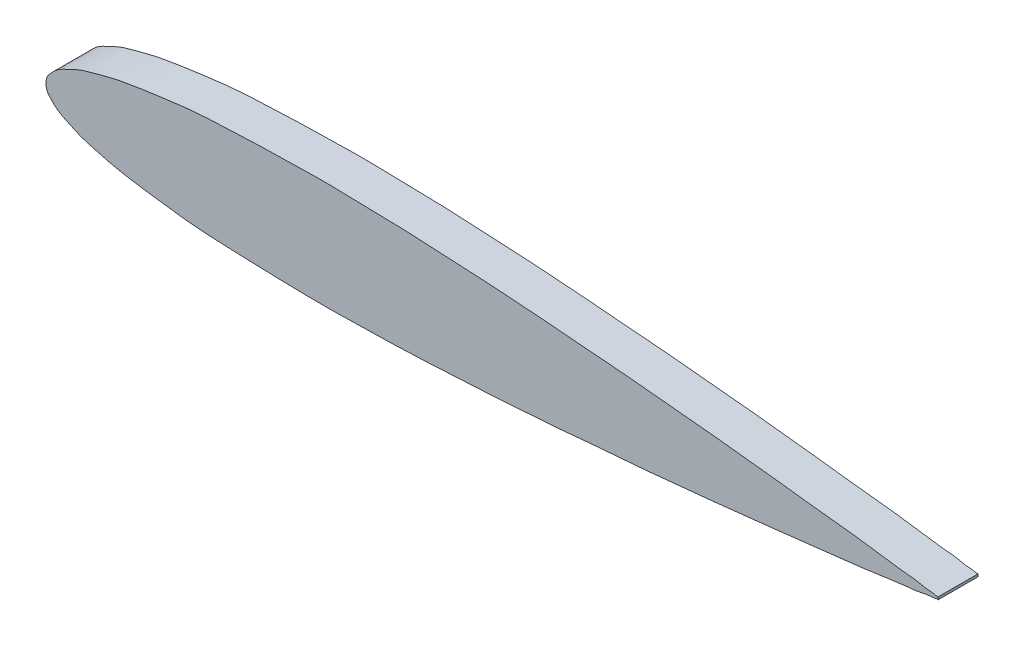
ISO-10303-21;
HEADER;
FILE_DESCRIPTION(('STEP AP214'),'2;1');
FILE_NAME('part.step','',(''),(''),'','','');
FILE_SCHEMA(('AUTOMOTIVE_DESIGN { 1 0 10303 214 1 1 1 1 }'));
ENDSEC;
DATA;
#1=APPLICATION_CONTEXT('core data for automotive mechanical design processes');
#2=APPLICATION_PROTOCOL_DEFINITION('international standard','automotive_design',2000,#1);
#3=PRODUCT_CONTEXT('',#1,'mechanical');
#4=PRODUCT('Part','Part','',(#3));
#5=PRODUCT_RELATED_PRODUCT_CATEGORY('part','',(#4));
#6=PRODUCT_DEFINITION_FORMATION('','',#4);
#7=PRODUCT_DEFINITION_CONTEXT('part definition',#1,'design');
#8=PRODUCT_DEFINITION('design','',#6,#7);
#9=PRODUCT_DEFINITION_SHAPE('','',#8);
#10=(LENGTH_UNIT() NAMED_UNIT(*) SI_UNIT(.MILLI.,.METRE.));
#11=(NAMED_UNIT(*) PLANE_ANGLE_UNIT() SI_UNIT($,.RADIAN.));
#12=(NAMED_UNIT(*) SI_UNIT($,.STERADIAN.) SOLID_ANGLE_UNIT());
#13=UNCERTAINTY_MEASURE_WITH_UNIT(LENGTH_MEASURE(1.E-05),#10,'distance_accuracy_value','');
#14=(GEOMETRIC_REPRESENTATION_CONTEXT(3) GLOBAL_UNCERTAINTY_ASSIGNED_CONTEXT((#13)) GLOBAL_UNIT_ASSIGNED_CONTEXT((#10,
#11,#12)) REPRESENTATION_CONTEXT('',''));
#15=CARTESIAN_POINT('',(0.,0.,0.));
#16=DIRECTION('',(0.,0.,1.));
#17=DIRECTION('',(1.,0.,0.));
#18=AXIS2_PLACEMENT_3D('',#15,#16,#17);
#19=CARTESIAN_POINT('',(0.,0.,-15.96));
#20=DIRECTION('',(0.,0.,1.));
#21=DIRECTION('',(1.,0.,0.));
#22=AXIS2_PLACEMENT_3D('',#19,#20,#21);
#23=PLANE('',#22);
#24=DIRECTION('',(0.,1.,0.));
#25=VECTOR('',#24,1.);
#26=CARTESIAN_POINT('',(357.89,0.51,-15.96));
#27=LINE('',#26,#25);
#28=CARTESIAN_POINT('',(357.89,-0.51,-15.96));
#29=VERTEX_POINT('',#28);
#30=CARTESIAN_POINT('',(357.89,0.51,-15.96));
#31=VERTEX_POINT('',#30);
#32=EDGE_CURVE('E78',#29,#31,#27,.T.);
#33=ORIENTED_EDGE('',*,*,#32,.F.);
#34=CARTESIAN_POINT('',(357.89,0.51,-15.96));
#35=CARTESIAN_POINT('',(357.719646917638,0.505921572841798,-15.96));
#36=CARTESIAN_POINT('',(357.031457109049,0.489445604421162,-15.96));
#37=CARTESIAN_POINT('',(355.448095415412,0.921810978975273,-15.96));
#38=CARTESIAN_POINT('',(352.680293301441,0.90095439623579,-15.96));
#39=CARTESIAN_POINT('',(348.957066021364,2.01520125980667,-15.96));
#40=CARTESIAN_POINT('',(344.0645014606,2.22917896767638,-15.96));
#41=CARTESIAN_POINT('',(338.235146468501,3.09922065903866,-15.96));
#42=CARTESIAN_POINT('',(331.393672923208,4.13758684020932,-15.96));
#43=CARTESIAN_POINT('',(323.597761630089,5.11628057463696,-15.96));
#44=CARTESIAN_POINT('',(314.882443830129,6.17828912685919,-15.96));
#45=CARTESIAN_POINT('',(305.293130734855,7.07725232689124,-15.96));
#46=CARTESIAN_POINT('',(294.985863675319,8.42983706148255,-15.96));
#47=CARTESIAN_POINT('',(283.977867006548,9.69066102593276,-15.96));
#48=CARTESIAN_POINT('',(272.375704707007,10.941886728925,-15.96));
#49=CARTESIAN_POINT('',(260.101492172459,12.2387824025472,-15.96));
#50=CARTESIAN_POINT('',(247.312075014399,13.4440845936858,-15.96));
#51=CARTESIAN_POINT('',(234.122924460674,14.8365121456862,-15.96));
#52=CARTESIAN_POINT('',(220.62780271951,15.648425333477,-15.96));
#53=CARTESIAN_POINT('',(206.943423861164,17.1374754411791,-15.96));
#54=CARTESIAN_POINT('',(193.035803629134,17.9766016297824,-15.96));
#55=CARTESIAN_POINT('',(178.998423130644,19.1472716709331,-15.96));
#56=CARTESIAN_POINT('',(164.930628496034,19.7652584635785,-15.96));
#57=CARTESIAN_POINT('',(150.970022584434,20.6192056737092,-15.96));
#58=CARTESIAN_POINT('',(137.249966534669,21.1393456722067,-15.96));
#59=CARTESIAN_POINT('',(123.783214426583,21.2841033943283,-15.96));
#60=CARTESIAN_POINT('',(110.659687231223,21.7439406265103,-15.96));
#61=CARTESIAN_POINT('',(97.8741361414242,21.2812625614655,-15.96));
#62=CARTESIAN_POINT('',(85.6735500131455,21.1922492666694,-15.96));
#63=CARTESIAN_POINT('',(73.9996496969005,20.5135685894506,-15.96));
#64=CARTESIAN_POINT('',(62.9682496415754,20.2247733516122,-15.96));
#65=CARTESIAN_POINT('',(52.6401030806784,19.1522879815025,-15.96));
#66=CARTESIAN_POINT('',(43.1755939216454,17.8091818067298,-15.96));
#67=CARTESIAN_POINT('',(34.518431340811,16.6108019228167,-15.96));
#68=CARTESIAN_POINT('',(26.6936934738994,15.1655174934838,-15.96));
#69=CARTESIAN_POINT('',(19.8862932147171,13.2851537730244,-15.96));
#70=CARTESIAN_POINT('',(13.8083523401894,11.6800943694312,-15.96));
#71=CARTESIAN_POINT('',(9.04993148298527,9.28720173126534,-15.96));
#72=CARTESIAN_POINT('',(4.93777046882712,7.46902396666879,-15.96));
#73=CARTESIAN_POINT('',(2.40834869494993,4.9776750118051,-15.96));
#74=CARTESIAN_POINT('',(0.307350295607263,2.75818606627847,-15.96));
#75=CARTESIAN_POINT('',(-0.145006844762799,0.,-15.96));
#76=CARTESIAN_POINT('',(0.307350295607263,-2.75818606627847,-15.96));
#77=CARTESIAN_POINT('',(2.40834869494993,-4.97767501180511,-15.96));
#78=CARTESIAN_POINT('',(4.9377704688271,-7.46902396666878,-15.96));
#79=CARTESIAN_POINT('',(9.0499314829853,-9.28720173126536,-15.96));
#80=CARTESIAN_POINT('',(13.8083523401894,-11.6800943694312,-15.96));
#81=CARTESIAN_POINT('',(19.8862932147171,-13.2851537730243,-15.96));
#82=CARTESIAN_POINT('',(26.6936934738993,-15.1655174934838,-15.96));
#83=CARTESIAN_POINT('',(34.5184313408111,-16.6108019228167,-15.96));
#84=CARTESIAN_POINT('',(43.1755939216453,-17.8091818067298,-15.96));
#85=CARTESIAN_POINT('',(52.6401030806785,-19.1522879815025,-15.96));
#86=CARTESIAN_POINT('',(62.9682496415753,-20.2247733516122,-15.96));
#87=CARTESIAN_POINT('',(73.9996496969005,-20.5135685894506,-15.96));
#88=CARTESIAN_POINT('',(85.6735500131454,-21.1922492666694,-15.96));
#89=CARTESIAN_POINT('',(97.8741361414243,-21.2812625614655,-15.96));
#90=CARTESIAN_POINT('',(110.659687231223,-21.7439406265103,-15.96));
#91=CARTESIAN_POINT('',(123.783214426583,-21.2841033943283,-15.96));
#92=CARTESIAN_POINT('',(137.249966534669,-21.1393456722067,-15.96));
#93=CARTESIAN_POINT('',(150.970022584434,-20.6192056737092,-15.96));
#94=CARTESIAN_POINT('',(164.930628496034,-19.7652584635785,-15.96));
#95=CARTESIAN_POINT('',(178.998423130644,-19.1472716709331,-15.96));
#96=CARTESIAN_POINT('',(193.035803629134,-17.9766016297824,-15.96));
#97=CARTESIAN_POINT('',(206.943423861164,-17.1374754411791,-15.96));
#98=CARTESIAN_POINT('',(220.62780271951,-15.648425333477,-15.96));
#99=CARTESIAN_POINT('',(234.122924460674,-14.8365121456862,-15.96));
#100=CARTESIAN_POINT('',(247.312075014399,-13.4440845936858,-15.96));
#101=CARTESIAN_POINT('',(260.101492172459,-12.2387824025472,-15.96));
#102=CARTESIAN_POINT('',(272.375704707007,-10.941886728925,-15.96));
#103=CARTESIAN_POINT('',(283.977867006547,-9.69066102593277,-15.96));
#104=CARTESIAN_POINT('',(294.985863675319,-8.42983706148255,-15.96));
#105=CARTESIAN_POINT('',(305.293130734855,-7.07725232689124,-15.96));
#106=CARTESIAN_POINT('',(314.882443830129,-6.17828912685919,-15.96));
#107=CARTESIAN_POINT('',(323.597761630088,-5.11628057463696,-15.96));
#108=CARTESIAN_POINT('',(331.393672923209,-4.13758684020931,-15.96));
#109=CARTESIAN_POINT('',(338.235146468501,-3.09922065903867,-15.96));
#110=CARTESIAN_POINT('',(344.0645014606,-2.22917896767638,-15.96));
#111=CARTESIAN_POINT('',(348.957066021365,-2.01520125980667,-15.96));
#112=CARTESIAN_POINT('',(352.680293301441,-0.900954396235786,-15.96));
#113=CARTESIAN_POINT('',(355.448095415412,-0.921810978975272,-15.96));
#114=CARTESIAN_POINT('',(357.031457109049,-0.489445604421162,-15.96));
#115=CARTESIAN_POINT('',(357.719646917638,-0.505921572841798,-15.96));
#116=CARTESIAN_POINT('',(357.89,-0.51,-15.96));
#117=B_SPLINE_CURVE_WITH_KNOTS('',3,(#34,#35,#36,#37,#38,#39,#40,#41,#42,#43,#44,#45,#46,#47,
#48,#49,#50,#51,#52,#53,#54,#55,#56,#57,#58,#59,#60,#61,#62,#63,#64,#65,#66,#67,#68,#69,#70,#71,
#72,#73,#74,#75,#76,#77,#78,#79,#80,#81,#82,#83,#84,#85,#86,#87,#88,#89,#90,#91,#92,#93,#94,#95,
#96,#97,#98,#99,#100,#101,#102,#103,#104,#105,#106,#107,#108,#109,#110,#111,#112,#113,#114,#115,
#116),.UNSPECIFIED.,.F.,.F.,(4,1,1,1,1,1,1,1,1,1,1,1,1,1,1,1,1,1,1,1,1,1,1,1,1,1,1,1,1,1,1,1,1,
1,1,1,1,1,1,1,1,1,1,1,1,1,1,1,1,1,1,1,1,1,1,1,1,1,1,1,1,1,1,1,1,1,1,1,1,1,1,1,1,1,1,1,1,1,1,1,
4),(0.,0.000698767546102638,0.00282287057641789,0.00666210294870497,0.0119851512501213,
0.0186396801468936,0.0267087250122721,0.0362091585625878,0.0470822882687063,0.0590024405257511,
0.0722964396022678,0.0866652687945305,0.101727960502694,0.1178390518878,0.134631365152862,
0.15245969992926,0.170642601576784,0.189137461126776,0.208016041696824,0.227206750787311,
0.246398452739791,0.265909542840843,0.285078596718305,0.303889796655365,0.322335219621859,
0.340437910137479,0.357841963230223,0.374903831461308,0.390580026839433,0.405899731285183,
0.420244749695898,0.433227432414806,0.445192580255448,0.456174796493744,0.465885160109924,
0.474250152506373,0.481884938165317,0.48779988101342,0.492476430267749,0.496450404883876,0.5,
0.503549595116124,0.507523569732251,0.51220011898658,0.518115061834683,0.525749847493627,
0.534114839890076,0.543825203506256,0.554807419744552,0.566772567585194,0.579755250304102,
0.594100268714817,0.609419973160567,0.625096168538692,0.642158036769777,0.659562089862521,
0.677664780378141,0.696110203344635,0.714921403281695,0.734090457159157,0.753601547260209,
0.772793249212689,0.791983958303176,0.810862538873224,0.829357398423216,0.847540300070741,
0.865368634847139,0.8821609481122,0.898272039497306,0.91333473120547,0.927703560397732,
0.940997559474249,0.952917711731294,0.963790841437412,0.973291274987728,0.981360319853106,
0.988014848749879,0.993337897051295,0.997177129423582,0.999301232453897,1.),.UNSPECIFIED.);
#118=EDGE_CURVE('E83',#31,#29,#117,.T.);
#119=ORIENTED_EDGE('',*,*,#118,.F.);
#120=EDGE_LOOP('',(#33,#119));
#121=FACE_BOUND('',#120,.T.);
#122=ADVANCED_FACE('F45',(#121),#23,.F.);
#123=DIRECTION('',(0.,0.,1.));
#124=VECTOR('',#123,1.);
#125=SURFACE_OF_LINEAR_EXTRUSION('',#117,#124);
#126=CARTESIAN_POINT('',(357.89,0.51,0.));
#127=CARTESIAN_POINT('',(357.719646917638,0.505921572841798,0.));
#128=CARTESIAN_POINT('',(357.031457109049,0.489445604421162,0.));
#129=CARTESIAN_POINT('',(355.448095415412,0.921810978975273,0.));
#130=CARTESIAN_POINT('',(352.680293301441,0.90095439623579,0.));
#131=CARTESIAN_POINT('',(348.957066021364,2.01520125980667,0.));
#132=CARTESIAN_POINT('',(344.0645014606,2.22917896767638,0.));
#133=CARTESIAN_POINT('',(338.235146468501,3.09922065903866,0.));
#134=CARTESIAN_POINT('',(331.393672923208,4.13758684020932,0.));
#135=CARTESIAN_POINT('',(323.597761630089,5.11628057463696,0.));
#136=CARTESIAN_POINT('',(314.882443830129,6.17828912685919,0.));
#137=CARTESIAN_POINT('',(305.293130734855,7.07725232689124,0.));
#138=CARTESIAN_POINT('',(294.985863675319,8.42983706148255,0.));
#139=CARTESIAN_POINT('',(283.977867006548,9.69066102593276,0.));
#140=CARTESIAN_POINT('',(272.375704707007,10.941886728925,0.));
#141=CARTESIAN_POINT('',(260.101492172459,12.2387824025472,0.));
#142=CARTESIAN_POINT('',(247.312075014399,13.4440845936858,0.));
#143=CARTESIAN_POINT('',(234.122924460674,14.8365121456862,0.));
#144=CARTESIAN_POINT('',(220.62780271951,15.648425333477,0.));
#145=CARTESIAN_POINT('',(206.943423861164,17.1374754411791,0.));
#146=CARTESIAN_POINT('',(193.035803629134,17.9766016297824,0.));
#147=CARTESIAN_POINT('',(178.998423130644,19.1472716709331,0.));
#148=CARTESIAN_POINT('',(164.930628496034,19.7652584635785,0.));
#149=CARTESIAN_POINT('',(150.970022584434,20.6192056737092,0.));
#150=CARTESIAN_POINT('',(137.249966534669,21.1393456722067,0.));
#151=CARTESIAN_POINT('',(123.783214426583,21.2841033943283,0.));
#152=CARTESIAN_POINT('',(110.659687231223,21.7439406265103,0.));
#153=CARTESIAN_POINT('',(97.8741361414242,21.2812625614655,0.));
#154=CARTESIAN_POINT('',(85.6735500131455,21.1922492666694,0.));
#155=CARTESIAN_POINT('',(73.9996496969005,20.5135685894506,0.));
#156=CARTESIAN_POINT('',(62.9682496415754,20.2247733516122,0.));
#157=CARTESIAN_POINT('',(52.6401030806784,19.1522879815025,0.));
#158=CARTESIAN_POINT('',(43.1755939216454,17.8091818067298,0.));
#159=CARTESIAN_POINT('',(34.518431340811,16.6108019228167,0.));
#160=CARTESIAN_POINT('',(26.6936934738994,15.1655174934838,0.));
#161=CARTESIAN_POINT('',(19.8862932147171,13.2851537730244,0.));
#162=CARTESIAN_POINT('',(13.8083523401894,11.6800943694312,0.));
#163=CARTESIAN_POINT('',(9.04993148298527,9.28720173126534,0.));
#164=CARTESIAN_POINT('',(4.93777046882712,7.46902396666879,0.));
#165=CARTESIAN_POINT('',(2.40834869494993,4.9776750118051,0.));
#166=CARTESIAN_POINT('',(0.307350295607263,2.75818606627847,0.));
#167=CARTESIAN_POINT('',(-0.145006844762799,0.,0.));
#168=CARTESIAN_POINT('',(0.307350295607263,-2.75818606627847,0.));
#169=CARTESIAN_POINT('',(2.40834869494993,-4.97767501180511,0.));
#170=CARTESIAN_POINT('',(4.9377704688271,-7.46902396666878,0.));
#171=CARTESIAN_POINT('',(9.0499314829853,-9.28720173126536,0.));
#172=CARTESIAN_POINT('',(13.8083523401894,-11.6800943694312,0.));
#173=CARTESIAN_POINT('',(19.8862932147171,-13.2851537730243,0.));
#174=CARTESIAN_POINT('',(26.6936934738993,-15.1655174934838,0.));
#175=CARTESIAN_POINT('',(34.5184313408111,-16.6108019228167,0.));
#176=CARTESIAN_POINT('',(43.1755939216453,-17.8091818067298,0.));
#177=CARTESIAN_POINT('',(52.6401030806785,-19.1522879815025,0.));
#178=CARTESIAN_POINT('',(62.9682496415753,-20.2247733516122,0.));
#179=CARTESIAN_POINT('',(73.9996496969005,-20.5135685894506,0.));
#180=CARTESIAN_POINT('',(85.6735500131454,-21.1922492666694,0.));
#181=CARTESIAN_POINT('',(97.8741361414243,-21.2812625614655,0.));
#182=CARTESIAN_POINT('',(110.659687231223,-21.7439406265103,0.));
#183=CARTESIAN_POINT('',(123.783214426583,-21.2841033943283,0.));
#184=CARTESIAN_POINT('',(137.249966534669,-21.1393456722067,0.));
#185=CARTESIAN_POINT('',(150.970022584434,-20.6192056737092,0.));
#186=CARTESIAN_POINT('',(164.930628496034,-19.7652584635785,0.));
#187=CARTESIAN_POINT('',(178.998423130644,-19.1472716709331,0.));
#188=CARTESIAN_POINT('',(193.035803629134,-17.9766016297824,0.));
#189=CARTESIAN_POINT('',(206.943423861164,-17.1374754411791,0.));
#190=CARTESIAN_POINT('',(220.62780271951,-15.648425333477,0.));
#191=CARTESIAN_POINT('',(234.122924460674,-14.8365121456862,0.));
#192=CARTESIAN_POINT('',(247.312075014399,-13.4440845936858,0.));
#193=CARTESIAN_POINT('',(260.101492172459,-12.2387824025472,0.));
#194=CARTESIAN_POINT('',(272.375704707007,-10.941886728925,0.));
#195=CARTESIAN_POINT('',(283.977867006547,-9.69066102593277,0.));
#196=CARTESIAN_POINT('',(294.985863675319,-8.42983706148255,0.));
#197=CARTESIAN_POINT('',(305.293130734855,-7.07725232689124,0.));
#198=CARTESIAN_POINT('',(314.882443830129,-6.17828912685919,0.));
#199=CARTESIAN_POINT('',(323.597761630088,-5.11628057463696,0.));
#200=CARTESIAN_POINT('',(331.393672923209,-4.13758684020931,0.));
#201=CARTESIAN_POINT('',(338.235146468501,-3.09922065903867,0.));
#202=CARTESIAN_POINT('',(344.0645014606,-2.22917896767638,0.));
#203=CARTESIAN_POINT('',(348.957066021365,-2.01520125980667,0.));
#204=CARTESIAN_POINT('',(352.680293301441,-0.900954396235786,0.));
#205=CARTESIAN_POINT('',(355.448095415412,-0.921810978975272,0.));
#206=CARTESIAN_POINT('',(357.031457109049,-0.489445604421162,0.));
#207=CARTESIAN_POINT('',(357.719646917638,-0.505921572841798,0.));
#208=CARTESIAN_POINT('',(357.89,-0.51,0.));
#209=B_SPLINE_CURVE_WITH_KNOTS('',3,(#126,#127,#128,#129,#130,#131,#132,#133,#134,#135,#136,
#137,#138,#139,#140,#141,#142,#143,#144,#145,#146,#147,#148,#149,#150,#151,#152,#153,#154,#155,
#156,#157,#158,#159,#160,#161,#162,#163,#164,#165,#166,#167,#168,#169,#170,#171,#172,#173,#174,
#175,#176,#177,#178,#179,#180,#181,#182,#183,#184,#185,#186,#187,#188,#189,#190,#191,#192,#193,
#194,#195,#196,#197,#198,#199,#200,#201,#202,#203,#204,#205,#206,#207,#208),.UNSPECIFIED.,.F.,
.F.,(4,1,1,1,1,1,1,1,1,1,1,1,1,1,1,1,1,1,1,1,1,1,1,1,1,1,1,1,1,1,1,1,1,1,1,1,1,1,1,1,1,1,1,1,1,
1,1,1,1,1,1,1,1,1,1,1,1,1,1,1,1,1,1,1,1,1,1,1,1,1,1,1,1,1,1,1,1,1,1,1,4),(0.,
0.000698767546102638,0.00282287057641789,0.00666210294870497,0.0119851512501213,
0.0186396801468936,0.0267087250122721,0.0362091585625878,0.0470822882687063,0.0590024405257511,
0.0722964396022678,0.0866652687945305,0.101727960502694,0.1178390518878,0.134631365152862,
0.15245969992926,0.170642601576784,0.189137461126776,0.208016041696824,0.227206750787311,
0.246398452739791,0.265909542840843,0.285078596718305,0.303889796655365,0.322335219621859,
0.340437910137479,0.357841963230223,0.374903831461308,0.390580026839433,0.405899731285183,
0.420244749695898,0.433227432414806,0.445192580255448,0.456174796493744,0.465885160109924,
0.474250152506373,0.481884938165317,0.48779988101342,0.492476430267749,0.496450404883876,0.5,
0.503549595116124,0.507523569732251,0.51220011898658,0.518115061834683,0.525749847493627,
0.534114839890076,0.543825203506256,0.554807419744552,0.566772567585194,0.579755250304102,
0.594100268714817,0.609419973160567,0.625096168538692,0.642158036769777,0.659562089862521,
0.677664780378141,0.696110203344635,0.714921403281695,0.734090457159157,0.753601547260209,
0.772793249212689,0.791983958303176,0.810862538873224,0.829357398423216,0.847540300070741,
0.865368634847139,0.8821609481122,0.898272039497306,0.91333473120547,0.927703560397732,
0.940997559474249,0.952917711731294,0.963790841437412,0.973291274987728,0.981360319853106,
0.988014848749879,0.993337897051295,0.997177129423582,0.999301232453897,1.),.UNSPECIFIED.);
#210=CARTESIAN_POINT('',(357.89,0.51,0.));
#211=VERTEX_POINT('',#210);
#212=CARTESIAN_POINT('',(357.89,-0.51,0.));
#213=VERTEX_POINT('',#212);
#214=EDGE_CURVE('E69',#211,#213,#209,.T.);
#215=ORIENTED_EDGE('',*,*,#214,.F.);
#216=DIRECTION('',(0.,0.,1.));
#217=VECTOR('',#216,1.);
#218=CARTESIAN_POINT('',(357.89,0.51,-15.96));
#219=LINE('',#218,#217);
#220=EDGE_CURVE('E11',#31,#211,#219,.T.);
#221=ORIENTED_EDGE('',*,*,#220,.F.);
#222=ORIENTED_EDGE('',*,*,#118,.T.);
#223=DIRECTION('',(0.,0.,1.));
#224=VECTOR('',#223,1.);
#225=CARTESIAN_POINT('',(357.89,-0.51,-15.96));
#226=LINE('',#225,#224);
#227=EDGE_CURVE('E50',#29,#213,#226,.T.);
#228=ORIENTED_EDGE('',*,*,#227,.T.);
#229=EDGE_LOOP('',(#215,#221,#222,#228));
#230=FACE_BOUND('',#229,.T.);
#231=ADVANCED_FACE('F47',(#230),#125,.T.);
#232=CARTESIAN_POINT('',(357.89,0.51,-15.96));
#233=DIRECTION('',(1.,0.,0.));
#234=DIRECTION('',(0.,0.,-1.));
#235=AXIS2_PLACEMENT_3D('',#232,#233,#234);
#236=PLANE('',#235);
#237=DIRECTION('',(0.,1.,0.));
#238=VECTOR('',#237,1.);
#239=CARTESIAN_POINT('',(357.89,0.51,0.));
#240=LINE('',#239,#238);
#241=EDGE_CURVE('E76',#213,#211,#240,.T.);
#242=ORIENTED_EDGE('',*,*,#241,.F.);
#243=ORIENTED_EDGE('',*,*,#227,.F.);
#244=ORIENTED_EDGE('',*,*,#32,.T.);
#245=ORIENTED_EDGE('',*,*,#220,.T.);
#246=EDGE_LOOP('',(#242,#243,#244,#245));
#247=FACE_BOUND('',#246,.T.);
#248=ADVANCED_FACE('F74',(#247),#236,.T.);
#249=CARTESIAN_POINT('',(0.,0.,0.));
#250=DIRECTION('',(0.,0.,1.));
#251=DIRECTION('',(1.,0.,0.));
#252=AXIS2_PLACEMENT_3D('',#249,#250,#251);
#253=PLANE('',#252);
#254=ORIENTED_EDGE('',*,*,#214,.T.);
#255=ORIENTED_EDGE('',*,*,#241,.T.);
#256=EDGE_LOOP('',(#254,#255));
#257=FACE_BOUND('',#256,.T.);
#258=ADVANCED_FACE('F81',(#257),#253,.T.);
#259=CLOSED_SHELL('',(#122,#231,#248,#258));
#260=MANIFOLD_SOLID_BREP('B2',#259);
#261=ADVANCED_BREP_SHAPE_REPRESENTATION('',(#18,#260),#14);
#262=SHAPE_DEFINITION_REPRESENTATION(#9,#261);
ENDSEC;
END-ISO-10303-21;
